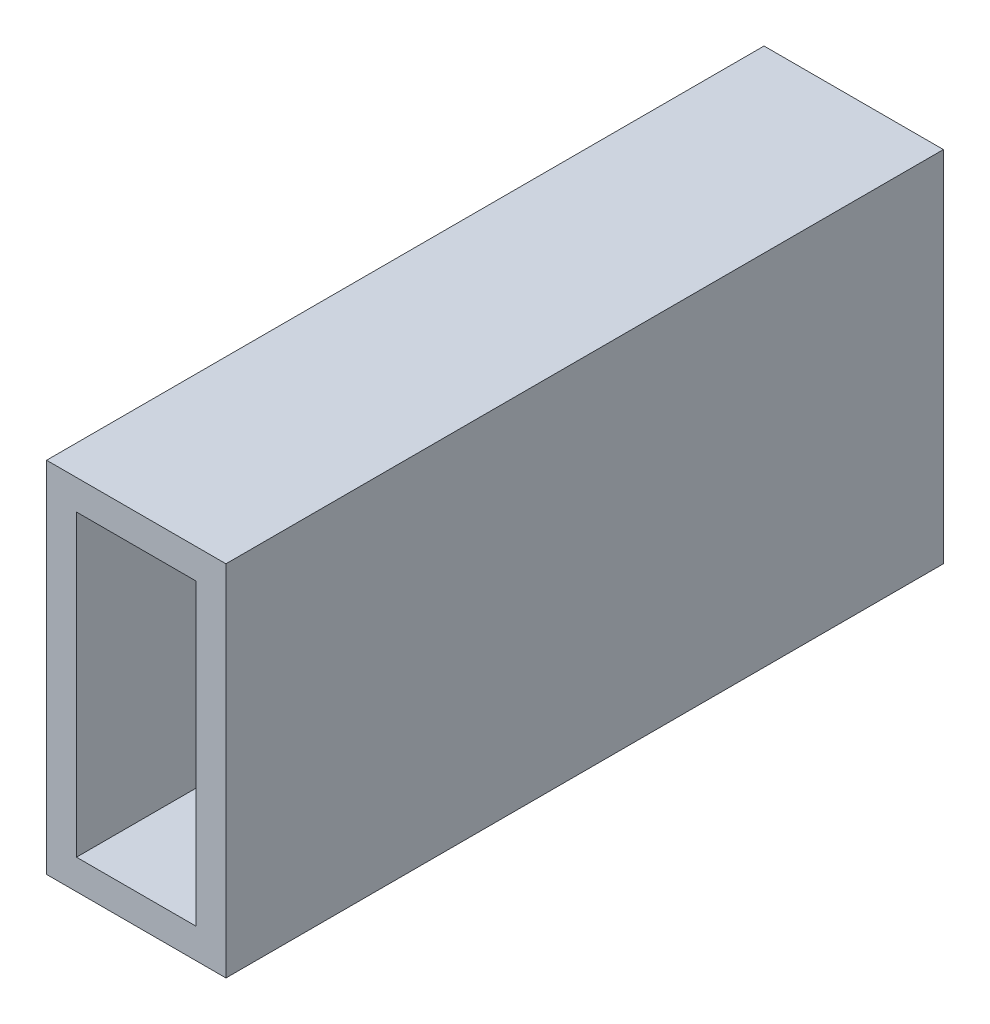
ISO-10303-21;
HEADER;
FILE_DESCRIPTION(('STEP AP214'),'2;1');
FILE_NAME('part.step','',(''),(''),'','','');
FILE_SCHEMA(('AUTOMOTIVE_DESIGN { 1 0 10303 214 1 1 1 1 }'));
ENDSEC;
DATA;
#1=APPLICATION_CONTEXT('core data for automotive mechanical design processes');
#2=APPLICATION_PROTOCOL_DEFINITION('international standard','automotive_design',2000,#1);
#3=PRODUCT_CONTEXT('',#1,'mechanical');
#4=PRODUCT('Part','Part','',(#3));
#5=PRODUCT_RELATED_PRODUCT_CATEGORY('part','',(#4));
#6=PRODUCT_DEFINITION_FORMATION('','',#4);
#7=PRODUCT_DEFINITION_CONTEXT('part definition',#1,'design');
#8=PRODUCT_DEFINITION('design','',#6,#7);
#9=PRODUCT_DEFINITION_SHAPE('','',#8);
#10=(LENGTH_UNIT() NAMED_UNIT(*) SI_UNIT(.MILLI.,.METRE.));
#11=(NAMED_UNIT(*) PLANE_ANGLE_UNIT() SI_UNIT($,.RADIAN.));
#12=(NAMED_UNIT(*) SI_UNIT($,.STERADIAN.) SOLID_ANGLE_UNIT());
#13=UNCERTAINTY_MEASURE_WITH_UNIT(LENGTH_MEASURE(1.E-05),#10,'distance_accuracy_value','');
#14=(GEOMETRIC_REPRESENTATION_CONTEXT(3) GLOBAL_UNCERTAINTY_ASSIGNED_CONTEXT((#13)) GLOBAL_UNIT_ASSIGNED_CONTEXT((#10,
#11,#12)) REPRESENTATION_CONTEXT('',''));
#15=CARTESIAN_POINT('',(0.,0.,0.));
#16=DIRECTION('',(0.,0.,1.));
#17=DIRECTION('',(1.,0.,0.));
#18=AXIS2_PLACEMENT_3D('',#15,#16,#17);
#19=CARTESIAN_POINT('',(0.,0.,76.2));
#20=DIRECTION('',(0.,0.,-1.));
#21=DIRECTION('',(-1.,0.,0.));
#22=AXIS2_PLACEMENT_3D('',#19,#20,#21);
#23=PLANE('',#22);
#24=DIRECTION('',(0.,1.,0.));
#25=VECTOR('',#24,1.);
#26=CARTESIAN_POINT('',(9.525,-19.05,76.2));
#27=LINE('',#26,#25);
#28=CARTESIAN_POINT('',(9.525,-19.05,76.2));
#29=VERTEX_POINT('',#28);
#30=CARTESIAN_POINT('',(9.525,19.05,76.2));
#31=VERTEX_POINT('',#30);
#32=EDGE_CURVE('E169',#29,#31,#27,.T.);
#33=ORIENTED_EDGE('',*,*,#32,.T.);
#34=DIRECTION('',(-1.,0.,0.));
#35=VECTOR('',#34,1.);
#36=CARTESIAN_POINT('',(-9.525,19.05,76.2));
#37=LINE('',#36,#35);
#38=CARTESIAN_POINT('',(-9.525,19.05,76.2));
#39=VERTEX_POINT('',#38);
#40=EDGE_CURVE('E173',#31,#39,#37,.T.);
#41=ORIENTED_EDGE('',*,*,#40,.T.);
#42=DIRECTION('',(0.,-1.,0.));
#43=VECTOR('',#42,1.);
#44=CARTESIAN_POINT('',(-9.525,-19.05,76.2));
#45=LINE('',#44,#43);
#46=CARTESIAN_POINT('',(-9.525,-19.05,76.2));
#47=VERTEX_POINT('',#46);
#48=EDGE_CURVE('E176',#39,#47,#45,.T.);
#49=ORIENTED_EDGE('',*,*,#48,.T.);
#50=DIRECTION('',(1.,0.,0.));
#51=VECTOR('',#50,1.);
#52=CARTESIAN_POINT('',(-9.525,-19.05,76.2));
#53=LINE('',#52,#51);
#54=EDGE_CURVE('E179',#47,#29,#53,.T.);
#55=ORIENTED_EDGE('',*,*,#54,.T.);
#56=EDGE_LOOP('',(#33,#41,#49,#55));
#57=FACE_BOUND('',#56,.T.);
#58=DIRECTION('',(1.,0.,0.));
#59=VECTOR('',#58,1.);
#60=CARTESIAN_POINT('',(-6.35,-15.875,76.2));
#61=LINE('',#60,#59);
#62=CARTESIAN_POINT('',(-6.35,-15.875,76.2));
#63=VERTEX_POINT('',#62);
#64=CARTESIAN_POINT('',(6.35,-15.875,76.2));
#65=VERTEX_POINT('',#64);
#66=EDGE_CURVE('E120',#63,#65,#61,.T.);
#67=ORIENTED_EDGE('',*,*,#66,.F.);
#68=DIRECTION('',(0.,-1.,0.));
#69=VECTOR('',#68,1.);
#70=CARTESIAN_POINT('',(-6.35,-15.875,76.2));
#71=LINE('',#70,#69);
#72=CARTESIAN_POINT('',(-6.35,15.875,76.2));
#73=VERTEX_POINT('',#72);
#74=EDGE_CURVE('E147',#73,#63,#71,.T.);
#75=ORIENTED_EDGE('',*,*,#74,.F.);
#76=DIRECTION('',(-1.,0.,0.));
#77=VECTOR('',#76,1.);
#78=CARTESIAN_POINT('',(-6.35,15.875,76.2));
#79=LINE('',#78,#77);
#80=CARTESIAN_POINT('',(6.35,15.875,76.2));
#81=VERTEX_POINT('',#80);
#82=EDGE_CURVE('E142',#81,#73,#79,.T.);
#83=ORIENTED_EDGE('',*,*,#82,.F.);
#84=DIRECTION('',(0.,1.,0.));
#85=VECTOR('',#84,1.);
#86=CARTESIAN_POINT('',(6.35,-15.875,76.2));
#87=LINE('',#86,#85);
#88=EDGE_CURVE('E129',#65,#81,#87,.T.);
#89=ORIENTED_EDGE('',*,*,#88,.F.);
#90=EDGE_LOOP('',(#67,#75,#83,#89));
#91=FACE_BOUND('',#90,.T.);
#92=ADVANCED_FACE('F38',(#57,#91),#23,.F.);
#93=CARTESIAN_POINT('',(0.,0.,0.));
#94=DIRECTION('',(0.,0.,-1.));
#95=DIRECTION('',(-1.,0.,0.));
#96=AXIS2_PLACEMENT_3D('',#93,#94,#95);
#97=PLANE('',#96);
#98=DIRECTION('',(0.,1.,0.));
#99=VECTOR('',#98,1.);
#100=CARTESIAN_POINT('',(9.525,-19.05,0.));
#101=LINE('',#100,#99);
#102=CARTESIAN_POINT('',(9.525,-19.05,0.));
#103=VERTEX_POINT('',#102);
#104=CARTESIAN_POINT('',(9.525,19.05,0.));
#105=VERTEX_POINT('',#104);
#106=EDGE_CURVE('E138',#103,#105,#101,.T.);
#107=ORIENTED_EDGE('',*,*,#106,.F.);
#108=DIRECTION('',(1.,0.,0.));
#109=VECTOR('',#108,1.);
#110=CARTESIAN_POINT('',(-9.525,-19.05,0.));
#111=LINE('',#110,#109);
#112=CARTESIAN_POINT('',(-9.525,-19.05,0.));
#113=VERTEX_POINT('',#112);
#114=EDGE_CURVE('E174',#113,#103,#111,.T.);
#115=ORIENTED_EDGE('',*,*,#114,.F.);
#116=DIRECTION('',(0.,-1.,0.));
#117=VECTOR('',#116,1.);
#118=CARTESIAN_POINT('',(-9.525,-19.05,0.));
#119=LINE('',#118,#117);
#120=CARTESIAN_POINT('',(-9.525,19.05,0.));
#121=VERTEX_POINT('',#120);
#122=EDGE_CURVE('E189',#121,#113,#119,.T.);
#123=ORIENTED_EDGE('',*,*,#122,.F.);
#124=DIRECTION('',(-1.,0.,0.));
#125=VECTOR('',#124,1.);
#126=CARTESIAN_POINT('',(-9.525,19.05,0.));
#127=LINE('',#126,#125);
#128=EDGE_CURVE('E186',#105,#121,#127,.T.);
#129=ORIENTED_EDGE('',*,*,#128,.F.);
#130=EDGE_LOOP('',(#107,#115,#123,#129));
#131=FACE_BOUND('',#130,.T.);
#132=DIRECTION('',(0.,-1.,0.));
#133=VECTOR('',#132,1.);
#134=CARTESIAN_POINT('',(-6.35,-15.875,0.));
#135=LINE('',#134,#133);
#136=CARTESIAN_POINT('',(-6.35,15.875,0.));
#137=VERTEX_POINT('',#136);
#138=CARTESIAN_POINT('',(-6.35,-15.875,0.));
#139=VERTEX_POINT('',#138);
#140=EDGE_CURVE('E130',#137,#139,#135,.T.);
#141=ORIENTED_EDGE('',*,*,#140,.T.);
#142=DIRECTION('',(1.,0.,0.));
#143=VECTOR('',#142,1.);
#144=CARTESIAN_POINT('',(-6.35,-15.875,0.));
#145=LINE('',#144,#143);
#146=CARTESIAN_POINT('',(6.35,-15.875,0.));
#147=VERTEX_POINT('',#146);
#148=EDGE_CURVE('E68',#139,#147,#145,.T.);
#149=ORIENTED_EDGE('',*,*,#148,.T.);
#150=DIRECTION('',(0.,1.,0.));
#151=VECTOR('',#150,1.);
#152=CARTESIAN_POINT('',(6.35,-15.875,0.));
#153=LINE('',#152,#151);
#154=CARTESIAN_POINT('',(6.35,15.875,0.));
#155=VERTEX_POINT('',#154);
#156=EDGE_CURVE('E136',#147,#155,#153,.T.);
#157=ORIENTED_EDGE('',*,*,#156,.T.);
#158=DIRECTION('',(-1.,0.,0.));
#159=VECTOR('',#158,1.);
#160=CARTESIAN_POINT('',(-6.35,15.875,0.));
#161=LINE('',#160,#159);
#162=EDGE_CURVE('E156',#155,#137,#161,.T.);
#163=ORIENTED_EDGE('',*,*,#162,.T.);
#164=EDGE_LOOP('',(#141,#149,#157,#163));
#165=FACE_BOUND('',#164,.T.);
#166=ADVANCED_FACE('F212',(#131,#165),#97,.T.);
#167=CARTESIAN_POINT('',(9.525,-19.05,76.2));
#168=DIRECTION('',(-1.,0.,0.));
#169=DIRECTION('',(0.,0.,1.));
#170=AXIS2_PLACEMENT_3D('',#167,#168,#169);
#171=PLANE('',#170);
#172=ORIENTED_EDGE('',*,*,#106,.T.);
#173=DIRECTION('',(0.,0.,-1.));
#174=VECTOR('',#173,1.);
#175=CARTESIAN_POINT('',(9.525,19.05,76.2));
#176=LINE('',#175,#174);
#177=EDGE_CURVE('E11',#31,#105,#176,.T.);
#178=ORIENTED_EDGE('',*,*,#177,.F.);
#179=ORIENTED_EDGE('',*,*,#32,.F.);
#180=DIRECTION('',(0.,0.,-1.));
#181=VECTOR('',#180,1.);
#182=CARTESIAN_POINT('',(9.525,-19.05,76.2));
#183=LINE('',#182,#181);
#184=EDGE_CURVE('E182',#29,#103,#183,.T.);
#185=ORIENTED_EDGE('',*,*,#184,.T.);
#186=EDGE_LOOP('',(#172,#178,#179,#185));
#187=FACE_BOUND('',#186,.T.);
#188=ADVANCED_FACE('F40',(#187),#171,.F.);
#189=CARTESIAN_POINT('',(-9.525,19.05,76.2));
#190=DIRECTION('',(0.,-1.,0.));
#191=DIRECTION('',(0.,0.,-1.));
#192=AXIS2_PLACEMENT_3D('',#189,#190,#191);
#193=PLANE('',#192);
#194=ORIENTED_EDGE('',*,*,#128,.T.);
#195=DIRECTION('',(0.,0.,-1.));
#196=VECTOR('',#195,1.);
#197=CARTESIAN_POINT('',(-9.525,19.05,76.2));
#198=LINE('',#197,#196);
#199=EDGE_CURVE('E47',#39,#121,#198,.T.);
#200=ORIENTED_EDGE('',*,*,#199,.F.);
#201=ORIENTED_EDGE('',*,*,#40,.F.);
#202=ORIENTED_EDGE('',*,*,#177,.T.);
#203=EDGE_LOOP('',(#194,#200,#201,#202));
#204=FACE_BOUND('',#203,.T.);
#205=ADVANCED_FACE('F222',(#204),#193,.F.);
#206=CARTESIAN_POINT('',(-9.525,-19.05,76.2));
#207=DIRECTION('',(1.,0.,0.));
#208=DIRECTION('',(0.,1.,0.));
#209=AXIS2_PLACEMENT_3D('',#206,#207,#208);
#210=PLANE('',#209);
#211=ORIENTED_EDGE('',*,*,#122,.T.);
#212=DIRECTION('',(0.,0.,-1.));
#213=VECTOR('',#212,1.);
#214=CARTESIAN_POINT('',(-9.525,-19.05,76.2));
#215=LINE('',#214,#213);
#216=EDGE_CURVE('E197',#47,#113,#215,.T.);
#217=ORIENTED_EDGE('',*,*,#216,.F.);
#218=ORIENTED_EDGE('',*,*,#48,.F.);
#219=ORIENTED_EDGE('',*,*,#199,.T.);
#220=EDGE_LOOP('',(#211,#217,#218,#219));
#221=FACE_BOUND('',#220,.T.);
#222=ADVANCED_FACE('F206',(#221),#210,.F.);
#223=CARTESIAN_POINT('',(-9.525,-19.05,76.2));
#224=DIRECTION('',(0.,1.,0.));
#225=DIRECTION('',(0.,0.,1.));
#226=AXIS2_PLACEMENT_3D('',#223,#224,#225);
#227=PLANE('',#226);
#228=ORIENTED_EDGE('',*,*,#114,.T.);
#229=ORIENTED_EDGE('',*,*,#184,.F.);
#230=ORIENTED_EDGE('',*,*,#54,.F.);
#231=ORIENTED_EDGE('',*,*,#216,.T.);
#232=EDGE_LOOP('',(#228,#229,#230,#231));
#233=FACE_BOUND('',#232,.T.);
#234=ADVANCED_FACE('F216',(#233),#227,.F.);
#235=CARTESIAN_POINT('',(-6.35,-15.875,76.2));
#236=DIRECTION('',(0.,1.,0.));
#237=DIRECTION('',(0.,0.,1.));
#238=AXIS2_PLACEMENT_3D('',#235,#236,#237);
#239=PLANE('',#238);
#240=ORIENTED_EDGE('',*,*,#148,.F.);
#241=DIRECTION('',(0.,0.,-1.));
#242=VECTOR('',#241,1.);
#243=CARTESIAN_POINT('',(-6.35,-15.875,76.2));
#244=LINE('',#243,#242);
#245=EDGE_CURVE('E124',#63,#139,#244,.T.);
#246=ORIENTED_EDGE('',*,*,#245,.F.);
#247=ORIENTED_EDGE('',*,*,#66,.T.);
#248=DIRECTION('',(0.,0.,-1.));
#249=VECTOR('',#248,1.);
#250=CARTESIAN_POINT('',(6.35,-15.875,76.2));
#251=LINE('',#250,#249);
#252=EDGE_CURVE('E123',#65,#147,#251,.T.);
#253=ORIENTED_EDGE('',*,*,#252,.T.);
#254=EDGE_LOOP('',(#240,#246,#247,#253));
#255=FACE_BOUND('',#254,.T.);
#256=ADVANCED_FACE('F122',(#255),#239,.T.);
#257=CARTESIAN_POINT('',(6.35,-15.875,76.2));
#258=DIRECTION('',(-1.,0.,0.));
#259=DIRECTION('',(0.,-1.,0.));
#260=AXIS2_PLACEMENT_3D('',#257,#258,#259);
#261=PLANE('',#260);
#262=ORIENTED_EDGE('',*,*,#156,.F.);
#263=ORIENTED_EDGE('',*,*,#252,.F.);
#264=ORIENTED_EDGE('',*,*,#88,.T.);
#265=DIRECTION('',(0.,0.,-1.));
#266=VECTOR('',#265,1.);
#267=CARTESIAN_POINT('',(6.35,15.875,76.2));
#268=LINE('',#267,#266);
#269=EDGE_CURVE('E139',#81,#155,#268,.T.);
#270=ORIENTED_EDGE('',*,*,#269,.T.);
#271=EDGE_LOOP('',(#262,#263,#264,#270));
#272=FACE_BOUND('',#271,.T.);
#273=ADVANCED_FACE('F133',(#272),#261,.T.);
#274=CARTESIAN_POINT('',(-6.35,15.875,76.2));
#275=DIRECTION('',(0.,-1.,0.));
#276=DIRECTION('',(1.,0.,0.));
#277=AXIS2_PLACEMENT_3D('',#274,#275,#276);
#278=PLANE('',#277);
#279=ORIENTED_EDGE('',*,*,#162,.F.);
#280=ORIENTED_EDGE('',*,*,#269,.F.);
#281=ORIENTED_EDGE('',*,*,#82,.T.);
#282=DIRECTION('',(0.,0.,-1.));
#283=VECTOR('',#282,1.);
#284=CARTESIAN_POINT('',(-6.35,15.875,76.2));
#285=LINE('',#284,#283);
#286=EDGE_CURVE('E57',#73,#137,#285,.T.);
#287=ORIENTED_EDGE('',*,*,#286,.T.);
#288=EDGE_LOOP('',(#279,#280,#281,#287));
#289=FACE_BOUND('',#288,.T.);
#290=ADVANCED_FACE('F245',(#289),#278,.T.);
#291=CARTESIAN_POINT('',(-6.35,-15.875,76.2));
#292=DIRECTION('',(1.,0.,0.));
#293=DIRECTION('',(0.,0.,-1.));
#294=AXIS2_PLACEMENT_3D('',#291,#292,#293);
#295=PLANE('',#294);
#296=ORIENTED_EDGE('',*,*,#140,.F.);
#297=ORIENTED_EDGE('',*,*,#286,.F.);
#298=ORIENTED_EDGE('',*,*,#74,.T.);
#299=ORIENTED_EDGE('',*,*,#245,.T.);
#300=EDGE_LOOP('',(#296,#297,#298,#299));
#301=FACE_BOUND('',#300,.T.);
#302=ADVANCED_FACE('F249',(#301),#295,.T.);
#303=CLOSED_SHELL('',(#92,#166,#188,#205,#222,#234,#256,#273,#290,#302));
#304=MANIFOLD_SOLID_BREP('B2',#303);
#305=ADVANCED_BREP_SHAPE_REPRESENTATION('',(#18,#304),#14);
#306=SHAPE_DEFINITION_REPRESENTATION(#9,#305);
ENDSEC;
END-ISO-10303-21;
